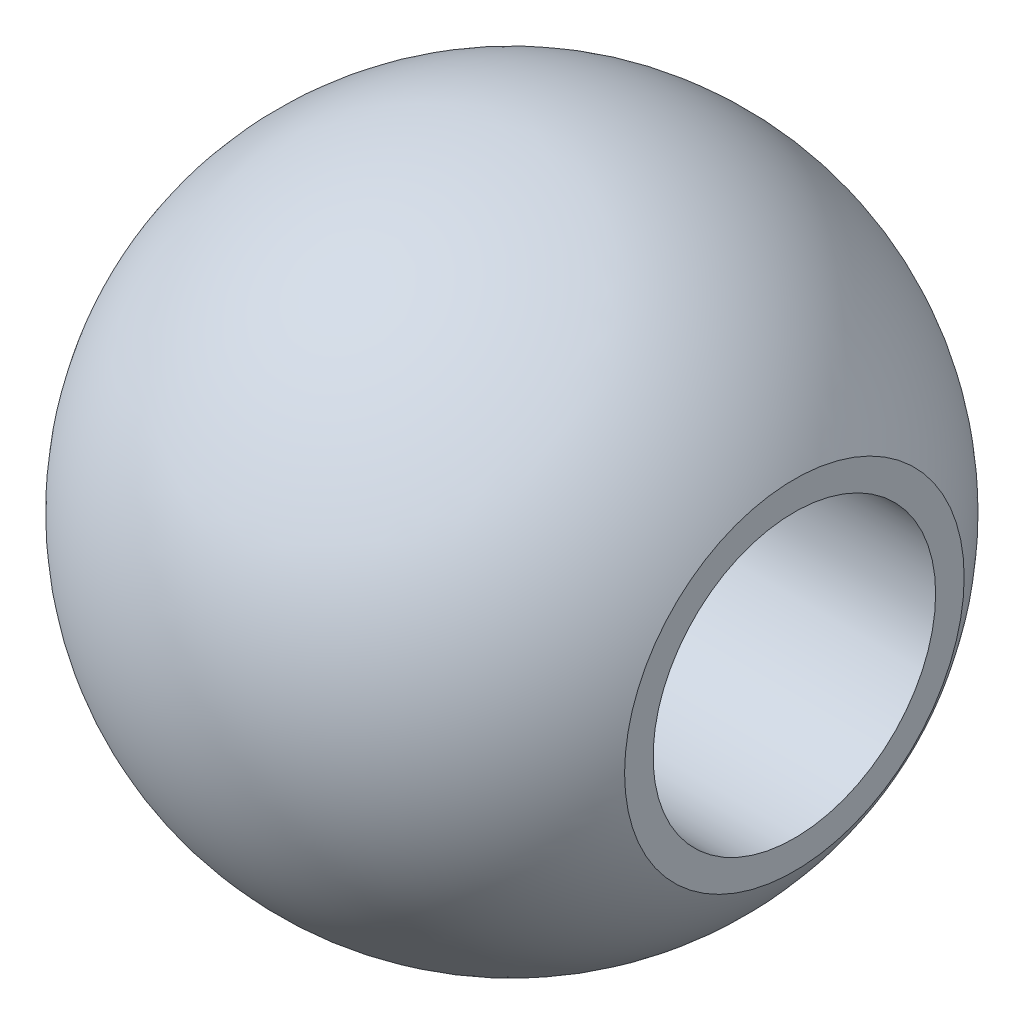
ISO-10303-21;
HEADER;
FILE_DESCRIPTION(('STEP AP214'),'2;1');
FILE_NAME('part.step','',(''),(''),'','','');
FILE_SCHEMA(('AUTOMOTIVE_DESIGN { 1 0 10303 214 1 1 1 1 }'));
ENDSEC;
DATA;
#1=APPLICATION_CONTEXT('core data for automotive mechanical design processes');
#2=APPLICATION_PROTOCOL_DEFINITION('international standard','automotive_design',2000,#1);
#3=PRODUCT_CONTEXT('',#1,'mechanical');
#4=PRODUCT('Part','Part','',(#3));
#5=PRODUCT_RELATED_PRODUCT_CATEGORY('part','',(#4));
#6=PRODUCT_DEFINITION_FORMATION('','',#4);
#7=PRODUCT_DEFINITION_CONTEXT('part definition',#1,'design');
#8=PRODUCT_DEFINITION('design','',#6,#7);
#9=PRODUCT_DEFINITION_SHAPE('','',#8);
#10=(LENGTH_UNIT() NAMED_UNIT(*) SI_UNIT(.MILLI.,.METRE.));
#11=(NAMED_UNIT(*) PLANE_ANGLE_UNIT() SI_UNIT($,.RADIAN.));
#12=(NAMED_UNIT(*) SI_UNIT($,.STERADIAN.) SOLID_ANGLE_UNIT());
#13=UNCERTAINTY_MEASURE_WITH_UNIT(LENGTH_MEASURE(1.E-05),#10,'distance_accuracy_value','');
#14=(GEOMETRIC_REPRESENTATION_CONTEXT(3) GLOBAL_UNCERTAINTY_ASSIGNED_CONTEXT((#13)) GLOBAL_UNIT_ASSIGNED_CONTEXT((#10,
#11,#12)) REPRESENTATION_CONTEXT('',''));
#15=CARTESIAN_POINT('',(0.,0.,0.));
#16=DIRECTION('',(0.,0.,1.));
#17=DIRECTION('',(1.,0.,0.));
#18=AXIS2_PLACEMENT_3D('',#15,#16,#17);
#19=CARTESIAN_POINT('',(0.,0.,0.));
#20=DIRECTION('',(1.,0.,0.));
#21=DIRECTION('',(0.,0.,-1.));
#22=AXIS2_PLACEMENT_3D('',#19,#20,#21);
#23=CYLINDRICAL_SURFACE('',#22,6.);
#24=CARTESIAN_POINT('',(12.,0.,0.));
#25=DIRECTION('',(1.,0.,0.));
#26=DIRECTION('',(0.,0.,-1.));
#27=AXIS2_PLACEMENT_3D('',#24,#25,#26);
#28=CIRCLE('',#27,6.);
#29=CARTESIAN_POINT('',(12.,0.,-6.));
#30=VERTEX_POINT('',#29);
#31=EDGE_CURVE('E27',#30,#30,#28,.T.);
#32=ORIENTED_EDGE('',*,*,#31,.T.);
#33=EDGE_LOOP('',(#32));
#34=FACE_BOUND('',#33,.T.);
#35=CARTESIAN_POINT('',(-12.,0.,0.));
#36=DIRECTION('',(1.,0.,0.));
#37=DIRECTION('',(0.,0.,-1.));
#38=AXIS2_PLACEMENT_3D('',#35,#36,#37);
#39=CIRCLE('',#38,6.);
#40=CARTESIAN_POINT('',(-12.,0.,-6.));
#41=VERTEX_POINT('',#40);
#42=EDGE_CURVE('E18',#41,#41,#39,.F.);
#43=ORIENTED_EDGE('',*,*,#42,.T.);
#44=EDGE_LOOP('',(#43));
#45=FACE_BOUND('',#44,.T.);
#46=ADVANCED_FACE('F15',(#34,#45),#23,.F.);
#47=CARTESIAN_POINT('',(-12.,-18.9576553918632,0.));
#48=DIRECTION('',(1.,0.,0.));
#49=DIRECTION('',(0.,1.,0.));
#50=AXIS2_PLACEMENT_3D('',#47,#48,#49);
#51=PLANE('',#50);
#52=ORIENTED_EDGE('',*,*,#42,.F.);
#53=EDGE_LOOP('',(#52));
#54=FACE_BOUND('',#53,.T.);
#55=CARTESIAN_POINT('',(-12.,0.,0.));
#56=DIRECTION('',(1.,0.,0.));
#57=DIRECTION('',(0.,0.,-1.));
#58=AXIS2_PLACEMENT_3D('',#55,#56,#57);
#59=CIRCLE('',#58,7.21110255092797);
#60=CARTESIAN_POINT('',(-12.,0.,-7.21110255092797));
#61=VERTEX_POINT('',#60);
#62=EDGE_CURVE('E22',#61,#61,#59,.T.);
#63=ORIENTED_EDGE('',*,*,#62,.F.);
#64=EDGE_LOOP('',(#63));
#65=FACE_BOUND('',#64,.T.);
#66=ADVANCED_FACE('F38',(#54,#65),#51,.F.);
#67=CARTESIAN_POINT('',(12.,19.2703589859558,0.));
#68=DIRECTION('',(-1.,0.,0.));
#69=DIRECTION('',(0.,0.,1.));
#70=AXIS2_PLACEMENT_3D('',#67,#68,#69);
#71=PLANE('',#70);
#72=ORIENTED_EDGE('',*,*,#31,.F.);
#73=EDGE_LOOP('',(#72));
#74=FACE_BOUND('',#73,.T.);
#75=CARTESIAN_POINT('',(12.,0.,0.));
#76=DIRECTION('',(1.,0.,0.));
#77=DIRECTION('',(0.,0.,-1.));
#78=AXIS2_PLACEMENT_3D('',#75,#76,#77);
#79=CIRCLE('',#78,7.21110255092798);
#80=CARTESIAN_POINT('',(12.,0.,-7.21110255092798));
#81=VERTEX_POINT('',#80);
#82=EDGE_CURVE('E10',#81,#81,#79,.F.);
#83=ORIENTED_EDGE('',*,*,#82,.F.);
#84=EDGE_LOOP('',(#83));
#85=FACE_BOUND('',#84,.T.);
#86=ADVANCED_FACE('F41',(#74,#85),#71,.F.);
#87=CARTESIAN_POINT('',(0.,0.,0.));
#88=DIRECTION('',(1.,0.,0.));
#89=DIRECTION('',(0.,1.,0.));
#90=AXIS2_PLACEMENT_3D('',#87,#88,#89);
#91=SPHERICAL_SURFACE('',#90,14.);
#92=ORIENTED_EDGE('',*,*,#82,.T.);
#93=EDGE_LOOP('',(#92));
#94=FACE_BOUND('',#93,.T.);
#95=ORIENTED_EDGE('',*,*,#62,.T.);
#96=EDGE_LOOP('',(#95));
#97=FACE_BOUND('',#96,.T.);
#98=ADVANCED_FACE('F44',(#94,#97),#91,.T.);
#99=CLOSED_SHELL('',(#46,#66,#86,#98));
#100=MANIFOLD_SOLID_BREP('B1',#99);
#101=ADVANCED_BREP_SHAPE_REPRESENTATION('',(#18,#100),#14);
#102=SHAPE_DEFINITION_REPRESENTATION(#9,#101);
ENDSEC;
END-ISO-10303-21;
